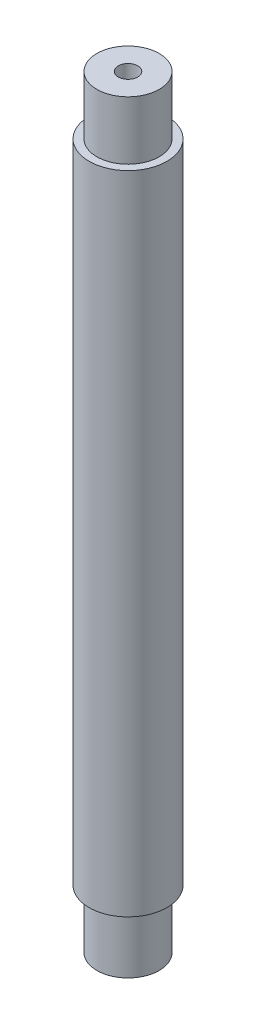
ISO-10303-21;
HEADER;
FILE_DESCRIPTION(('STEP AP214'),'2;1');
FILE_NAME('part.step','',(''),(''),'','','');
FILE_SCHEMA(('AUTOMOTIVE_DESIGN { 1 0 10303 214 1 1 1 1 }'));
ENDSEC;
DATA;
#1=APPLICATION_CONTEXT('core data for automotive mechanical design processes');
#2=APPLICATION_PROTOCOL_DEFINITION('international standard','automotive_design',2000,#1);
#3=PRODUCT_CONTEXT('',#1,'mechanical');
#4=PRODUCT('Part','Part','',(#3));
#5=PRODUCT_RELATED_PRODUCT_CATEGORY('part','',(#4));
#6=PRODUCT_DEFINITION_FORMATION('','',#4);
#7=PRODUCT_DEFINITION_CONTEXT('part definition',#1,'design');
#8=PRODUCT_DEFINITION('design','',#6,#7);
#9=PRODUCT_DEFINITION_SHAPE('','',#8);
#10=(LENGTH_UNIT() NAMED_UNIT(*) SI_UNIT(.MILLI.,.METRE.));
#11=(NAMED_UNIT(*) PLANE_ANGLE_UNIT() SI_UNIT($,.RADIAN.));
#12=(NAMED_UNIT(*) SI_UNIT($,.STERADIAN.) SOLID_ANGLE_UNIT());
#13=UNCERTAINTY_MEASURE_WITH_UNIT(LENGTH_MEASURE(1.E-05),#10,'distance_accuracy_value','');
#14=(GEOMETRIC_REPRESENTATION_CONTEXT(3) GLOBAL_UNCERTAINTY_ASSIGNED_CONTEXT((#13)) GLOBAL_UNIT_ASSIGNED_CONTEXT((#10,
#11,#12)) REPRESENTATION_CONTEXT('',''));
#15=CARTESIAN_POINT('',(0.,0.,0.));
#16=DIRECTION('',(0.,0.,1.));
#17=DIRECTION('',(1.,0.,0.));
#18=AXIS2_PLACEMENT_3D('',#15,#16,#17);
#19=CARTESIAN_POINT('',(0.,0.,0.));
#20=DIRECTION('',(0.,-1.,0.));
#21=DIRECTION('',(0.,0.,-1.));
#22=AXIS2_PLACEMENT_3D('',#19,#20,#21);
#23=CYLINDRICAL_SURFACE('',#22,7.99999999999999);
#24=CARTESIAN_POINT('',(0.,18.,0.));
#25=DIRECTION('',(0.,-1.,0.));
#26=DIRECTION('',(0.,0.,-1.));
#27=AXIS2_PLACEMENT_3D('',#24,#25,#26);
#28=CIRCLE('',#27,8.);
#29=CARTESIAN_POINT('',(0.,18.,-8.));
#30=VERTEX_POINT('',#29);
#31=EDGE_CURVE('E10',#30,#30,#28,.T.);
#32=ORIENTED_EDGE('',*,*,#31,.T.);
#33=EDGE_LOOP('',(#32));
#34=FACE_BOUND('',#33,.T.);
#35=CARTESIAN_POINT('',(0.,178.,0.));
#36=DIRECTION('',(0.,-1.,0.));
#37=DIRECTION('',(0.,0.,-1.));
#38=AXIS2_PLACEMENT_3D('',#35,#36,#37);
#39=CIRCLE('',#38,7.99999999999998);
#40=CARTESIAN_POINT('',(0.,178.,-7.99999999999998));
#41=VERTEX_POINT('',#40);
#42=EDGE_CURVE('E65',#41,#41,#39,.T.);
#43=ORIENTED_EDGE('',*,*,#42,.F.);
#44=EDGE_LOOP('',(#43));
#45=FACE_BOUND('',#44,.T.);
#46=ADVANCED_FACE('F31',(#34,#45),#23,.F.);
#47=CARTESIAN_POINT('',(0.,18.,0.));
#48=DIRECTION('',(0.,1.,0.));
#49=DIRECTION('',(0.,0.,1.));
#50=AXIS2_PLACEMENT_3D('',#47,#48,#49);
#51=PLANE('',#50);
#52=ORIENTED_EDGE('',*,*,#31,.F.);
#53=EDGE_LOOP('',(#52));
#54=FACE_BOUND('',#53,.T.);
#55=ADVANCED_FACE('F73',(#54),#51,.T.);
#56=CARTESIAN_POINT('',(0.,0.,0.));
#57=DIRECTION('',(0.,-1.,0.));
#58=DIRECTION('',(0.,0.,-1.));
#59=AXIS2_PLACEMENT_3D('',#56,#57,#58);
#60=PLANE('',#59);
#61=CARTESIAN_POINT('',(0.,0.,0.));
#62=DIRECTION('',(0.,-1.,0.));
#63=DIRECTION('',(0.,0.,-1.));
#64=AXIS2_PLACEMENT_3D('',#61,#62,#63);
#65=CIRCLE('',#64,8.);
#66=CARTESIAN_POINT('',(0.,0.,-8.));
#67=VERTEX_POINT('',#66);
#68=EDGE_CURVE('E37',#67,#67,#65,.T.);
#69=ORIENTED_EDGE('',*,*,#68,.T.);
#70=EDGE_LOOP('',(#69));
#71=FACE_BOUND('',#70,.T.);
#72=ADVANCED_FACE('F77',(#71),#60,.T.);
#73=CARTESIAN_POINT('',(0.,0.,0.));
#74=DIRECTION('',(0.,-1.,0.));
#75=DIRECTION('',(0.,0.,-1.));
#76=AXIS2_PLACEMENT_3D('',#73,#74,#75);
#77=CYLINDRICAL_SURFACE('',#76,8.);
#78=CARTESIAN_POINT('',(0.,15.,0.));
#79=DIRECTION('',(0.,-1.,0.));
#80=DIRECTION('',(0.,0.,-1.));
#81=AXIS2_PLACEMENT_3D('',#78,#79,#80);
#82=CIRCLE('',#81,8.);
#83=CARTESIAN_POINT('',(0.,15.,-8.));
#84=VERTEX_POINT('',#83);
#85=EDGE_CURVE('E41',#84,#84,#82,.T.);
#86=ORIENTED_EDGE('',*,*,#85,.T.);
#87=EDGE_LOOP('',(#86));
#88=FACE_BOUND('',#87,.T.);
#89=ORIENTED_EDGE('',*,*,#68,.F.);
#90=EDGE_LOOP('',(#89));
#91=FACE_BOUND('',#90,.T.);
#92=ADVANCED_FACE('F82',(#88,#91),#77,.T.);
#93=CARTESIAN_POINT('',(0.,15.,0.));
#94=DIRECTION('',(0.,-1.,0.));
#95=DIRECTION('',(0.,0.,-1.));
#96=AXIS2_PLACEMENT_3D('',#93,#94,#95);
#97=PLANE('',#96);
#98=CARTESIAN_POINT('',(0.,15.,0.));
#99=DIRECTION('',(0.,-1.,0.));
#100=DIRECTION('',(0.,0.,-1.));
#101=AXIS2_PLACEMENT_3D('',#98,#99,#100);
#102=CIRCLE('',#101,10.);
#103=CARTESIAN_POINT('',(0.,15.,-10.));
#104=VERTEX_POINT('',#103);
#105=EDGE_CURVE('E45',#104,#104,#102,.T.);
#106=ORIENTED_EDGE('',*,*,#105,.T.);
#107=EDGE_LOOP('',(#106));
#108=FACE_BOUND('',#107,.T.);
#109=ORIENTED_EDGE('',*,*,#85,.F.);
#110=EDGE_LOOP('',(#109));
#111=FACE_BOUND('',#110,.T.);
#112=ADVANCED_FACE('F87',(#108,#111),#97,.T.);
#113=CARTESIAN_POINT('',(0.,0.,0.));
#114=DIRECTION('',(0.,-1.,0.));
#115=DIRECTION('',(0.,0.,-1.));
#116=AXIS2_PLACEMENT_3D('',#113,#114,#115);
#117=CYLINDRICAL_SURFACE('',#116,10.);
#118=CARTESIAN_POINT('',(0.,181.,0.));
#119=DIRECTION('',(0.,-1.,0.));
#120=DIRECTION('',(0.,0.,-1.));
#121=AXIS2_PLACEMENT_3D('',#118,#119,#120);
#122=CIRCLE('',#121,10.);
#123=CARTESIAN_POINT('',(0.,181.,-10.));
#124=VERTEX_POINT('',#123);
#125=EDGE_CURVE('E50',#124,#124,#122,.T.);
#126=ORIENTED_EDGE('',*,*,#125,.T.);
#127=EDGE_LOOP('',(#126));
#128=FACE_BOUND('',#127,.T.);
#129=ORIENTED_EDGE('',*,*,#105,.F.);
#130=EDGE_LOOP('',(#129));
#131=FACE_BOUND('',#130,.T.);
#132=ADVANCED_FACE('F91',(#128,#131),#117,.T.);
#133=CARTESIAN_POINT('',(0.,181.,0.));
#134=DIRECTION('',(0.,1.,0.));
#135=DIRECTION('',(0.,0.,1.));
#136=AXIS2_PLACEMENT_3D('',#133,#134,#135);
#137=PLANE('',#136);
#138=CARTESIAN_POINT('',(0.,181.,0.));
#139=DIRECTION('',(0.,-1.,0.));
#140=DIRECTION('',(0.,0.,-1.));
#141=AXIS2_PLACEMENT_3D('',#138,#139,#140);
#142=CIRCLE('',#141,7.99999999999997);
#143=CARTESIAN_POINT('',(0.,181.,-7.99999999999997));
#144=VERTEX_POINT('',#143);
#145=EDGE_CURVE('E53',#144,#144,#142,.T.);
#146=ORIENTED_EDGE('',*,*,#145,.T.);
#147=EDGE_LOOP('',(#146));
#148=FACE_BOUND('',#147,.T.);
#149=ORIENTED_EDGE('',*,*,#125,.F.);
#150=EDGE_LOOP('',(#149));
#151=FACE_BOUND('',#150,.T.);
#152=ADVANCED_FACE('F95',(#148,#151),#137,.T.);
#153=CARTESIAN_POINT('',(0.,0.,0.));
#154=DIRECTION('',(0.,-1.,0.));
#155=DIRECTION('',(0.,0.,-1.));
#156=AXIS2_PLACEMENT_3D('',#153,#154,#155);
#157=CYLINDRICAL_SURFACE('',#156,7.99999999999998);
#158=CARTESIAN_POINT('',(0.,196.,0.));
#159=DIRECTION('',(0.,-1.,0.));
#160=DIRECTION('',(0.,0.,-1.));
#161=AXIS2_PLACEMENT_3D('',#158,#159,#160);
#162=CIRCLE('',#161,7.99999999999998);
#163=CARTESIAN_POINT('',(0.,196.,-7.99999999999998));
#164=VERTEX_POINT('',#163);
#165=EDGE_CURVE('E56',#164,#164,#162,.T.);
#166=ORIENTED_EDGE('',*,*,#165,.T.);
#167=EDGE_LOOP('',(#166));
#168=FACE_BOUND('',#167,.T.);
#169=ORIENTED_EDGE('',*,*,#145,.F.);
#170=EDGE_LOOP('',(#169));
#171=FACE_BOUND('',#170,.T.);
#172=ADVANCED_FACE('F99',(#168,#171),#157,.T.);
#173=CARTESIAN_POINT('',(0.,196.,0.));
#174=DIRECTION('',(0.,1.,0.));
#175=DIRECTION('',(0.,0.,1.));
#176=AXIS2_PLACEMENT_3D('',#173,#174,#175);
#177=PLANE('',#176);
#178=CARTESIAN_POINT('',(0.,196.,0.));
#179=DIRECTION('',(0.,-1.,0.));
#180=DIRECTION('',(0.,0.,-1.));
#181=AXIS2_PLACEMENT_3D('',#178,#179,#180);
#182=CIRCLE('',#181,2.5);
#183=CARTESIAN_POINT('',(0.,196.,-2.5));
#184=VERTEX_POINT('',#183);
#185=EDGE_CURVE('E59',#184,#184,#182,.T.);
#186=ORIENTED_EDGE('',*,*,#185,.T.);
#187=EDGE_LOOP('',(#186));
#188=FACE_BOUND('',#187,.T.);
#189=ORIENTED_EDGE('',*,*,#165,.F.);
#190=EDGE_LOOP('',(#189));
#191=FACE_BOUND('',#190,.T.);
#192=ADVANCED_FACE('F103',(#188,#191),#177,.T.);
#193=CARTESIAN_POINT('',(0.,0.,0.));
#194=DIRECTION('',(0.,-1.,0.));
#195=DIRECTION('',(0.,0.,-1.));
#196=AXIS2_PLACEMENT_3D('',#193,#194,#195);
#197=CYLINDRICAL_SURFACE('',#196,2.5);
#198=CARTESIAN_POINT('',(0.,178.,0.));
#199=DIRECTION('',(0.,-1.,0.));
#200=DIRECTION('',(0.,0.,-1.));
#201=AXIS2_PLACEMENT_3D('',#198,#199,#200);
#202=CIRCLE('',#201,2.5);
#203=CARTESIAN_POINT('',(0.,178.,-2.5));
#204=VERTEX_POINT('',#203);
#205=EDGE_CURVE('E62',#204,#204,#202,.T.);
#206=ORIENTED_EDGE('',*,*,#205,.T.);
#207=EDGE_LOOP('',(#206));
#208=FACE_BOUND('',#207,.T.);
#209=ORIENTED_EDGE('',*,*,#185,.F.);
#210=EDGE_LOOP('',(#209));
#211=FACE_BOUND('',#210,.T.);
#212=ADVANCED_FACE('F107',(#208,#211),#197,.F.);
#213=CARTESIAN_POINT('',(0.,178.,0.));
#214=DIRECTION('',(0.,-1.,0.));
#215=DIRECTION('',(0.,0.,-1.));
#216=AXIS2_PLACEMENT_3D('',#213,#214,#215);
#217=PLANE('',#216);
#218=ORIENTED_EDGE('',*,*,#42,.T.);
#219=EDGE_LOOP('',(#218));
#220=FACE_BOUND('',#219,.T.);
#221=ORIENTED_EDGE('',*,*,#205,.F.);
#222=EDGE_LOOP('',(#221));
#223=FACE_BOUND('',#222,.T.);
#224=ADVANCED_FACE('F69',(#220,#223),#217,.T.);
#225=CLOSED_SHELL('',(#46,#55,#72,#92,#112,#132,#152,#172,#192,#212,#224));
#226=MANIFOLD_SOLID_BREP('B2',#225);
#227=ADVANCED_BREP_SHAPE_REPRESENTATION('',(#18,#226),#14);
#228=SHAPE_DEFINITION_REPRESENTATION(#9,#227);
ENDSEC;
END-ISO-10303-21;
